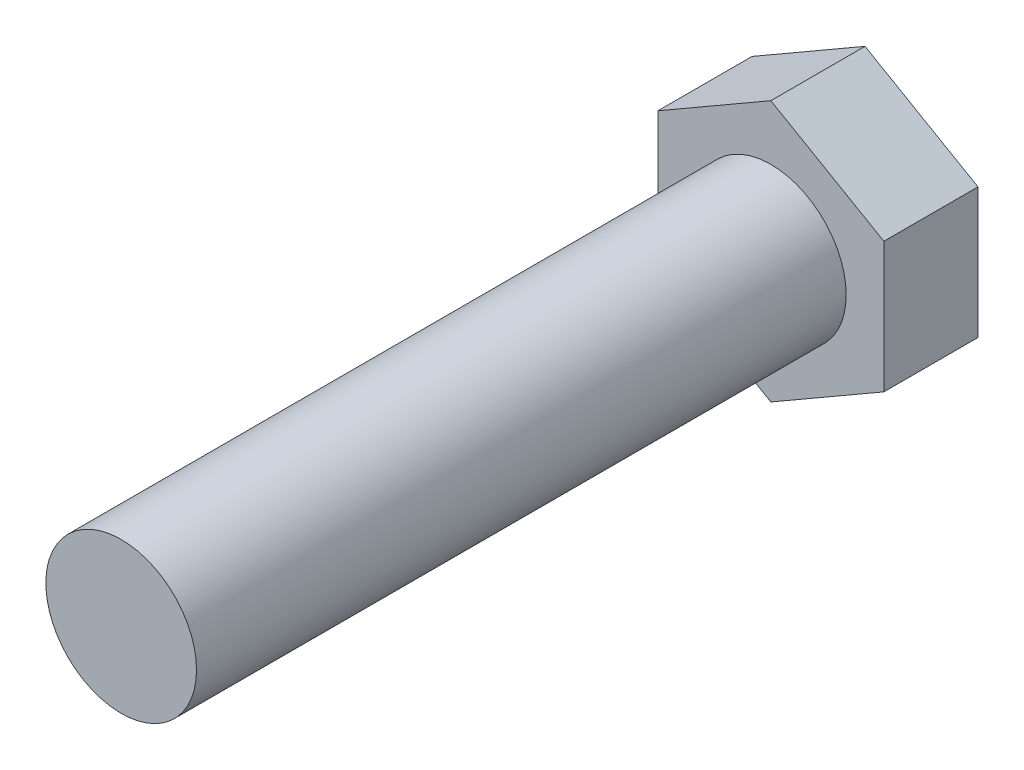
ISO-10303-21;
HEADER;
FILE_DESCRIPTION(('STEP AP214'),'2;1');
FILE_NAME('part.step','',(''),(''),'','','');
FILE_SCHEMA(('AUTOMOTIVE_DESIGN { 1 0 10303 214 1 1 1 1 }'));
ENDSEC;
DATA;
#1=APPLICATION_CONTEXT('core data for automotive mechanical design processes');
#2=APPLICATION_PROTOCOL_DEFINITION('international standard','automotive_design',2000,#1);
#3=PRODUCT_CONTEXT('',#1,'mechanical');
#4=PRODUCT('Part','Part','',(#3));
#5=PRODUCT_RELATED_PRODUCT_CATEGORY('part','',(#4));
#6=PRODUCT_DEFINITION_FORMATION('','',#4);
#7=PRODUCT_DEFINITION_CONTEXT('part definition',#1,'design');
#8=PRODUCT_DEFINITION('design','',#6,#7);
#9=PRODUCT_DEFINITION_SHAPE('','',#8);
#10=(LENGTH_UNIT() NAMED_UNIT(*) SI_UNIT(.MILLI.,.METRE.));
#11=(NAMED_UNIT(*) PLANE_ANGLE_UNIT() SI_UNIT($,.RADIAN.));
#12=(NAMED_UNIT(*) SI_UNIT($,.STERADIAN.) SOLID_ANGLE_UNIT());
#13=UNCERTAINTY_MEASURE_WITH_UNIT(LENGTH_MEASURE(1.E-05),#10,'distance_accuracy_value','');
#14=(GEOMETRIC_REPRESENTATION_CONTEXT(3) GLOBAL_UNCERTAINTY_ASSIGNED_CONTEXT((#13)) GLOBAL_UNIT_ASSIGNED_CONTEXT((#10,
#11,#12)) REPRESENTATION_CONTEXT('',''));
#15=CARTESIAN_POINT('',(0.,0.,0.));
#16=DIRECTION('',(0.,0.,1.));
#17=DIRECTION('',(1.,0.,0.));
#18=AXIS2_PLACEMENT_3D('',#15,#16,#17);
#19=CARTESIAN_POINT('',(6.,3.46410161513776,5.));
#20=DIRECTION('',(-0.5,-0.866025403784439,0.));
#21=DIRECTION('',(0.866025403784439,-0.5,0.));
#22=AXIS2_PLACEMENT_3D('',#19,#20,#21);
#23=PLANE('',#22);
#24=DIRECTION('',(-0.866025403784439,0.5,0.));
#25=VECTOR('',#24,1.);
#26=CARTESIAN_POINT('',(6.,3.46410161513776,0.));
#27=LINE('',#26,#25);
#28=CARTESIAN_POINT('',(6.,3.46410161513776,0.));
#29=VERTEX_POINT('',#28);
#30=CARTESIAN_POINT('',(0.,6.92820323027551,0.));
#31=VERTEX_POINT('',#30);
#32=EDGE_CURVE('E136',#29,#31,#27,.T.);
#33=ORIENTED_EDGE('',*,*,#32,.T.);
#34=DIRECTION('',(0.,0.,-1.));
#35=VECTOR('',#34,1.);
#36=CARTESIAN_POINT('',(0.,6.92820323027551,5.));
#37=LINE('',#36,#35);
#38=CARTESIAN_POINT('',(0.,6.92820323027551,5.));
#39=VERTEX_POINT('',#38);
#40=EDGE_CURVE('E48',#39,#31,#37,.T.);
#41=ORIENTED_EDGE('',*,*,#40,.F.);
#42=DIRECTION('',(-0.866025403784439,0.5,0.));
#43=VECTOR('',#42,1.);
#44=CARTESIAN_POINT('',(6.,3.46410161513776,5.));
#45=LINE('',#44,#43);
#46=CARTESIAN_POINT('',(6.,3.46410161513776,5.));
#47=VERTEX_POINT('',#46);
#48=EDGE_CURVE('E153',#47,#39,#45,.T.);
#49=ORIENTED_EDGE('',*,*,#48,.F.);
#50=DIRECTION('',(0.,0.,-1.));
#51=VECTOR('',#50,1.);
#52=CARTESIAN_POINT('',(6.,3.46410161513776,5.));
#53=LINE('',#52,#51);
#54=EDGE_CURVE('E132',#47,#29,#53,.T.);
#55=ORIENTED_EDGE('',*,*,#54,.T.);
#56=EDGE_LOOP('',(#33,#41,#49,#55));
#57=FACE_BOUND('',#56,.T.);
#58=ADVANCED_FACE('F45',(#57),#23,.F.);
#59=CARTESIAN_POINT('',(0.,6.92820323027551,5.));
#60=DIRECTION('',(0.5,-0.866025403784439,0.));
#61=DIRECTION('',(0.866025403784439,0.5,0.));
#62=AXIS2_PLACEMENT_3D('',#59,#60,#61);
#63=PLANE('',#62);
#64=DIRECTION('',(-0.866025403784439,-0.5,0.));
#65=VECTOR('',#64,1.);
#66=CARTESIAN_POINT('',(0.,6.92820323027551,0.));
#67=LINE('',#66,#65);
#68=CARTESIAN_POINT('',(-6.,3.46410161513776,0.));
#69=VERTEX_POINT('',#68);
#70=EDGE_CURVE('E140',#31,#69,#67,.T.);
#71=ORIENTED_EDGE('',*,*,#70,.T.);
#72=DIRECTION('',(0.,0.,-1.));
#73=VECTOR('',#72,1.);
#74=CARTESIAN_POINT('',(-6.,3.46410161513776,5.));
#75=LINE('',#74,#73);
#76=CARTESIAN_POINT('',(-6.,3.46410161513776,5.));
#77=VERTEX_POINT('',#76);
#78=EDGE_CURVE('E159',#77,#69,#75,.T.);
#79=ORIENTED_EDGE('',*,*,#78,.F.);
#80=DIRECTION('',(-0.866025403784439,-0.5,0.));
#81=VECTOR('',#80,1.);
#82=CARTESIAN_POINT('',(0.,6.92820323027551,5.));
#83=LINE('',#82,#81);
#84=EDGE_CURVE('E101',#39,#77,#83,.T.);
#85=ORIENTED_EDGE('',*,*,#84,.F.);
#86=ORIENTED_EDGE('',*,*,#40,.T.);
#87=EDGE_LOOP('',(#71,#79,#85,#86));
#88=FACE_BOUND('',#87,.T.);
#89=ADVANCED_FACE('F166',(#88),#63,.F.);
#90=CARTESIAN_POINT('',(-6.,3.46410161513776,5.));
#91=DIRECTION('',(1.,0.,0.));
#92=DIRECTION('',(0.,0.,-1.));
#93=AXIS2_PLACEMENT_3D('',#90,#91,#92);
#94=PLANE('',#93);
#95=DIRECTION('',(0.,-1.,0.));
#96=VECTOR('',#95,1.);
#97=CARTESIAN_POINT('',(-6.,3.46410161513776,0.));
#98=LINE('',#97,#96);
#99=CARTESIAN_POINT('',(-6.,-3.46410161513775,0.));
#100=VERTEX_POINT('',#99);
#101=EDGE_CURVE('E144',#69,#100,#98,.T.);
#102=ORIENTED_EDGE('',*,*,#101,.T.);
#103=DIRECTION('',(0.,0.,-1.));
#104=VECTOR('',#103,1.);
#105=CARTESIAN_POINT('',(-6.,-3.46410161513775,5.));
#106=LINE('',#105,#104);
#107=CARTESIAN_POINT('',(-6.,-3.46410161513775,5.));
#108=VERTEX_POINT('',#107);
#109=EDGE_CURVE('E125',#108,#100,#106,.T.);
#110=ORIENTED_EDGE('',*,*,#109,.F.);
#111=DIRECTION('',(0.,-1.,0.));
#112=VECTOR('',#111,1.);
#113=CARTESIAN_POINT('',(-6.,3.46410161513776,5.));
#114=LINE('',#113,#112);
#115=EDGE_CURVE('E114',#77,#108,#114,.T.);
#116=ORIENTED_EDGE('',*,*,#115,.F.);
#117=ORIENTED_EDGE('',*,*,#78,.T.);
#118=EDGE_LOOP('',(#102,#110,#116,#117));
#119=FACE_BOUND('',#118,.T.);
#120=ADVANCED_FACE('F172',(#119),#94,.F.);
#121=CARTESIAN_POINT('',(-6.,-3.46410161513775,5.));
#122=DIRECTION('',(0.5,0.866025403784438,0.));
#123=DIRECTION('',(-0.866025403784439,0.5,0.));
#124=AXIS2_PLACEMENT_3D('',#121,#122,#123);
#125=PLANE('',#124);
#126=DIRECTION('',(0.866025403784438,-0.5,0.));
#127=VECTOR('',#126,1.);
#128=CARTESIAN_POINT('',(-6.,-3.46410161513775,0.));
#129=LINE('',#128,#127);
#130=CARTESIAN_POINT('',(0.,-6.92820323027551,0.));
#131=VERTEX_POINT('',#130);
#132=EDGE_CURVE('E123',#100,#131,#129,.T.);
#133=ORIENTED_EDGE('',*,*,#132,.T.);
#134=DIRECTION('',(0.,0.,-1.));
#135=VECTOR('',#134,1.);
#136=CARTESIAN_POINT('',(0.,-6.92820323027551,5.));
#137=LINE('',#136,#135);
#138=CARTESIAN_POINT('',(0.,-6.92820323027551,5.));
#139=VERTEX_POINT('',#138);
#140=EDGE_CURVE('E120',#139,#131,#137,.T.);
#141=ORIENTED_EDGE('',*,*,#140,.F.);
#142=DIRECTION('',(0.866025403784438,-0.5,0.));
#143=VECTOR('',#142,1.);
#144=CARTESIAN_POINT('',(-6.,-3.46410161513775,5.));
#145=LINE('',#144,#143);
#146=EDGE_CURVE('E108',#108,#139,#145,.T.);
#147=ORIENTED_EDGE('',*,*,#146,.F.);
#148=ORIENTED_EDGE('',*,*,#109,.T.);
#149=EDGE_LOOP('',(#133,#141,#147,#148));
#150=FACE_BOUND('',#149,.T.);
#151=ADVANCED_FACE('F121',(#150),#125,.F.);
#152=CARTESIAN_POINT('',(0.,-6.92820323027551,5.));
#153=DIRECTION('',(-0.5,0.866025403784439,0.));
#154=DIRECTION('',(-0.866025403784439,-0.5,0.));
#155=AXIS2_PLACEMENT_3D('',#152,#153,#154);
#156=PLANE('',#155);
#157=DIRECTION('',(0.866025403784439,0.5,0.));
#158=VECTOR('',#157,1.);
#159=CARTESIAN_POINT('',(0.,-6.92820323027551,0.));
#160=LINE('',#159,#158);
#161=CARTESIAN_POINT('',(6.,-3.46410161513776,0.));
#162=VERTEX_POINT('',#161);
#163=EDGE_CURVE('E86',#131,#162,#160,.T.);
#164=ORIENTED_EDGE('',*,*,#163,.T.);
#165=DIRECTION('',(0.,0.,-1.));
#166=VECTOR('',#165,1.);
#167=CARTESIAN_POINT('',(6.,-3.46410161513776,5.));
#168=LINE('',#167,#166);
#169=CARTESIAN_POINT('',(6.,-3.46410161513776,5.));
#170=VERTEX_POINT('',#169);
#171=EDGE_CURVE('E126',#170,#162,#168,.T.);
#172=ORIENTED_EDGE('',*,*,#171,.F.);
#173=DIRECTION('',(0.866025403784439,0.5,0.));
#174=VECTOR('',#173,1.);
#175=CARTESIAN_POINT('',(0.,-6.92820323027551,5.));
#176=LINE('',#175,#174);
#177=EDGE_CURVE('E112',#139,#170,#176,.T.);
#178=ORIENTED_EDGE('',*,*,#177,.F.);
#179=ORIENTED_EDGE('',*,*,#140,.T.);
#180=EDGE_LOOP('',(#164,#172,#178,#179));
#181=FACE_BOUND('',#180,.T.);
#182=ADVANCED_FACE('F128',(#181),#156,.F.);
#183=CARTESIAN_POINT('',(6.,-3.46410161513776,5.));
#184=DIRECTION('',(-1.,0.,0.));
#185=DIRECTION('',(0.,-1.,0.));
#186=AXIS2_PLACEMENT_3D('',#183,#184,#185);
#187=PLANE('',#186);
#188=DIRECTION('',(0.,1.,0.));
#189=VECTOR('',#188,1.);
#190=CARTESIAN_POINT('',(6.,-3.46410161513776,0.));
#191=LINE('',#190,#189);
#192=EDGE_CURVE('E92',#162,#29,#191,.T.);
#193=ORIENTED_EDGE('',*,*,#192,.T.);
#194=ORIENTED_EDGE('',*,*,#54,.F.);
#195=DIRECTION('',(0.,1.,0.));
#196=VECTOR('',#195,1.);
#197=CARTESIAN_POINT('',(6.,-3.46410161513776,5.));
#198=LINE('',#197,#196);
#199=EDGE_CURVE('E63',#170,#47,#198,.T.);
#200=ORIENTED_EDGE('',*,*,#199,.F.);
#201=ORIENTED_EDGE('',*,*,#171,.T.);
#202=EDGE_LOOP('',(#193,#194,#200,#201));
#203=FACE_BOUND('',#202,.T.);
#204=ADVANCED_FACE('F192',(#203),#187,.F.);
#205=CARTESIAN_POINT('',(0.,0.,5.));
#206=DIRECTION('',(0.,0.,1.));
#207=DIRECTION('',(1.,0.,0.));
#208=AXIS2_PLACEMENT_3D('',#205,#206,#207);
#209=PLANE('',#208);
#210=CARTESIAN_POINT('',(0.,0.,5.));
#211=DIRECTION('',(0.,0.,1.));
#212=DIRECTION('',(1.,0.,0.));
#213=AXIS2_PLACEMENT_3D('',#210,#211,#212);
#214=CIRCLE('',#213,4.);
#215=CARTESIAN_POINT('',(4.,0.,5.));
#216=VERTEX_POINT('',#215);
#217=EDGE_CURVE('E11',#216,#216,#214,.T.);
#218=ORIENTED_EDGE('',*,*,#217,.F.);
#219=EDGE_LOOP('',(#218));
#220=FACE_BOUND('',#219,.T.);
#221=ORIENTED_EDGE('',*,*,#48,.T.);
#222=ORIENTED_EDGE('',*,*,#84,.T.);
#223=ORIENTED_EDGE('',*,*,#115,.T.);
#224=ORIENTED_EDGE('',*,*,#146,.T.);
#225=ORIENTED_EDGE('',*,*,#177,.T.);
#226=ORIENTED_EDGE('',*,*,#199,.T.);
#227=EDGE_LOOP('',(#221,#222,#223,#224,#225,#226));
#228=FACE_BOUND('',#227,.T.);
#229=ADVANCED_FACE('F110',(#220,#228),#209,.T.);
#230=CARTESIAN_POINT('',(0.,0.,0.));
#231=DIRECTION('',(0.,0.,1.));
#232=DIRECTION('',(1.,0.,0.));
#233=AXIS2_PLACEMENT_3D('',#230,#231,#232);
#234=PLANE('',#233);
#235=ORIENTED_EDGE('',*,*,#32,.F.);
#236=ORIENTED_EDGE('',*,*,#192,.F.);
#237=ORIENTED_EDGE('',*,*,#163,.F.);
#238=ORIENTED_EDGE('',*,*,#132,.F.);
#239=ORIENTED_EDGE('',*,*,#101,.F.);
#240=ORIENTED_EDGE('',*,*,#70,.F.);
#241=EDGE_LOOP('',(#235,#236,#237,#238,#239,#240));
#242=FACE_BOUND('',#241,.T.);
#243=ADVANCED_FACE('F171',(#242),#234,.F.);
#244=CARTESIAN_POINT('',(0.,0.,39.5));
#245=DIRECTION('',(0.,0.,-1.));
#246=DIRECTION('',(-1.,0.,0.));
#247=AXIS2_PLACEMENT_3D('',#244,#245,#246);
#248=CYLINDRICAL_SURFACE('',#247,4.);
#249=CARTESIAN_POINT('',(0.,0.,39.5));
#250=DIRECTION('',(0.,0.,1.));
#251=DIRECTION('',(1.,0.,0.));
#252=AXIS2_PLACEMENT_3D('',#249,#250,#251);
#253=CIRCLE('',#252,4.);
#254=CARTESIAN_POINT('',(4.,0.,39.5));
#255=VERTEX_POINT('',#254);
#256=EDGE_CURVE('E141',#255,#255,#253,.T.);
#257=ORIENTED_EDGE('',*,*,#256,.F.);
#258=EDGE_LOOP('',(#257));
#259=FACE_BOUND('',#258,.T.);
#260=ORIENTED_EDGE('',*,*,#217,.T.);
#261=EDGE_LOOP('',(#260));
#262=FACE_BOUND('',#261,.T.);
#263=ADVANCED_FACE('F185',(#259,#262),#248,.T.);
#264=CARTESIAN_POINT('',(0.,0.,39.5));
#265=DIRECTION('',(0.,0.,1.));
#266=DIRECTION('',(1.,0.,0.));
#267=AXIS2_PLACEMENT_3D('',#264,#265,#266);
#268=PLANE('',#267);
#269=ORIENTED_EDGE('',*,*,#256,.T.);
#270=EDGE_LOOP('',(#269));
#271=FACE_BOUND('',#270,.T.);
#272=ADVANCED_FACE('F183',(#271),#268,.T.);
#273=CLOSED_SHELL('',(#58,#89,#120,#151,#182,#204,#229,#243,#263,#272));
#274=MANIFOLD_SOLID_BREP('B2',#273);
#275=ADVANCED_BREP_SHAPE_REPRESENTATION('',(#18,#274),#14);
#276=SHAPE_DEFINITION_REPRESENTATION(#9,#275);
ENDSEC;
END-ISO-10303-21;
